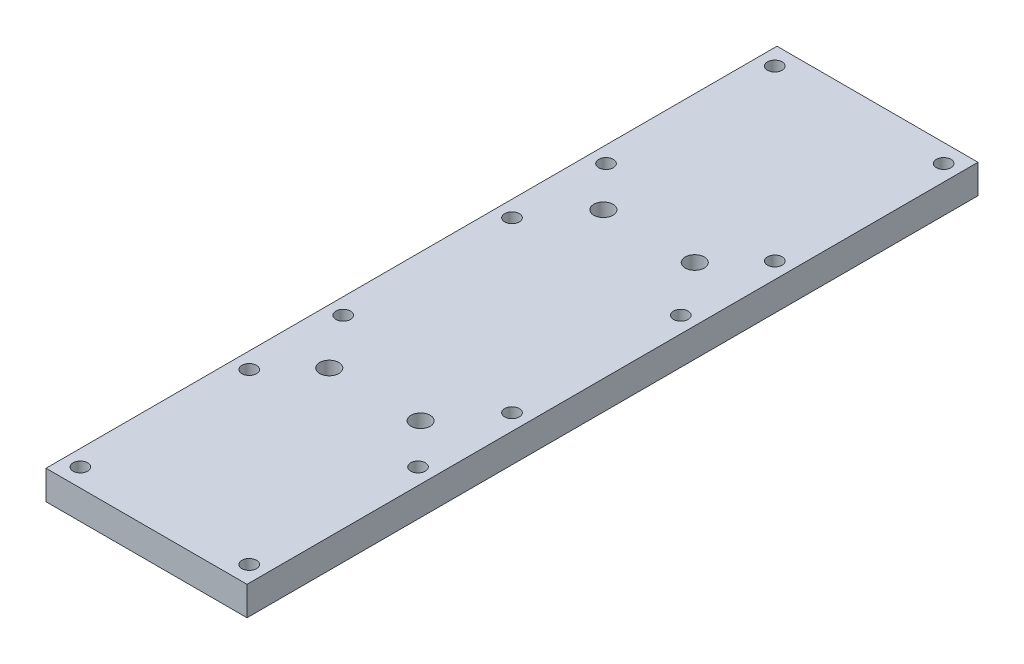
ISO-10303-21;
HEADER;
FILE_DESCRIPTION(('STEP AP214'),'2;1');
FILE_NAME('part.step','',(''),(''),'','','');
FILE_SCHEMA(('AUTOMOTIVE_DESIGN { 1 0 10303 214 1 1 1 1 }'));
ENDSEC;
DATA;
#1=APPLICATION_CONTEXT('core data for automotive mechanical design processes');
#2=APPLICATION_PROTOCOL_DEFINITION('international standard','automotive_design',2000,#1);
#3=PRODUCT_CONTEXT('',#1,'mechanical');
#4=PRODUCT('Part','Part','',(#3));
#5=PRODUCT_RELATED_PRODUCT_CATEGORY('part','',(#4));
#6=PRODUCT_DEFINITION_FORMATION('','',#4);
#7=PRODUCT_DEFINITION_CONTEXT('part definition',#1,'design');
#8=PRODUCT_DEFINITION('design','',#6,#7);
#9=PRODUCT_DEFINITION_SHAPE('','',#8);
#10=(LENGTH_UNIT() NAMED_UNIT(*) SI_UNIT(.MILLI.,.METRE.));
#11=(NAMED_UNIT(*) PLANE_ANGLE_UNIT() SI_UNIT($,.RADIAN.));
#12=(NAMED_UNIT(*) SI_UNIT($,.STERADIAN.) SOLID_ANGLE_UNIT());
#13=UNCERTAINTY_MEASURE_WITH_UNIT(LENGTH_MEASURE(1.E-05),#10,'distance_accuracy_value','');
#14=(GEOMETRIC_REPRESENTATION_CONTEXT(3) GLOBAL_UNCERTAINTY_ASSIGNED_CONTEXT((#13)) GLOBAL_UNIT_ASSIGNED_CONTEXT((#10,
#11,#12)) REPRESENTATION_CONTEXT('',''));
#15=CARTESIAN_POINT('',(0.,0.,0.));
#16=DIRECTION('',(0.,0.,1.));
#17=DIRECTION('',(1.,0.,0.));
#18=AXIS2_PLACEMENT_3D('',#15,#16,#17);
#19=CARTESIAN_POINT('',(22.,6.35,-80.));
#20=DIRECTION('',(-1.,0.,0.));
#21=DIRECTION('',(0.,0.,1.));
#22=AXIS2_PLACEMENT_3D('',#19,#20,#21);
#23=PLANE('',#22);
#24=DIRECTION('',(0.,0.,-1.));
#25=VECTOR('',#24,1.);
#26=CARTESIAN_POINT('',(22.,0.,-80.));
#27=LINE('',#26,#25);
#28=CARTESIAN_POINT('',(22.,0.,80.));
#29=VERTEX_POINT('',#28);
#30=CARTESIAN_POINT('',(22.,0.,-80.));
#31=VERTEX_POINT('',#30);
#32=EDGE_CURVE('E95',#29,#31,#27,.T.);
#33=ORIENTED_EDGE('',*,*,#32,.T.);
#34=DIRECTION('',(0.,-1.,0.));
#35=VECTOR('',#34,1.);
#36=CARTESIAN_POINT('',(22.,6.35,-80.));
#37=LINE('',#36,#35);
#38=CARTESIAN_POINT('',(22.,6.35,-80.));
#39=VERTEX_POINT('',#38);
#40=EDGE_CURVE('E11',#39,#31,#37,.T.);
#41=ORIENTED_EDGE('',*,*,#40,.F.);
#42=DIRECTION('',(0.,0.,-1.));
#43=VECTOR('',#42,1.);
#44=CARTESIAN_POINT('',(22.,6.35,-80.));
#45=LINE('',#44,#43);
#46=CARTESIAN_POINT('',(22.,6.35,80.));
#47=VERTEX_POINT('',#46);
#48=EDGE_CURVE('E83',#47,#39,#45,.T.);
#49=ORIENTED_EDGE('',*,*,#48,.F.);
#50=DIRECTION('',(0.,-1.,0.));
#51=VECTOR('',#50,1.);
#52=CARTESIAN_POINT('',(22.,6.35,80.));
#53=LINE('',#52,#51);
#54=EDGE_CURVE('E91',#47,#29,#53,.T.);
#55=ORIENTED_EDGE('',*,*,#54,.T.);
#56=EDGE_LOOP('',(#33,#41,#49,#55));
#57=FACE_BOUND('',#56,.T.);
#58=ADVANCED_FACE('F32',(#57),#23,.F.);
#59=CARTESIAN_POINT('',(-22.,6.35,-80.));
#60=DIRECTION('',(0.,0.,1.));
#61=DIRECTION('',(1.,0.,0.));
#62=AXIS2_PLACEMENT_3D('',#59,#60,#61);
#63=PLANE('',#62);
#64=DIRECTION('',(-1.,0.,0.));
#65=VECTOR('',#64,1.);
#66=CARTESIAN_POINT('',(-22.,0.,-80.));
#67=LINE('',#66,#65);
#68=CARTESIAN_POINT('',(-22.,0.,-80.));
#69=VERTEX_POINT('',#68);
#70=EDGE_CURVE('E87',#31,#69,#67,.T.);
#71=ORIENTED_EDGE('',*,*,#70,.T.);
#72=DIRECTION('',(0.,-1.,0.));
#73=VECTOR('',#72,1.);
#74=CARTESIAN_POINT('',(-22.,6.35,-80.));
#75=LINE('',#74,#73);
#76=CARTESIAN_POINT('',(-22.,6.35,-80.));
#77=VERTEX_POINT('',#76);
#78=EDGE_CURVE('E40',#77,#69,#75,.T.);
#79=ORIENTED_EDGE('',*,*,#78,.F.);
#80=DIRECTION('',(-1.,0.,0.));
#81=VECTOR('',#80,1.);
#82=CARTESIAN_POINT('',(-22.,6.35,-80.));
#83=LINE('',#82,#81);
#84=EDGE_CURVE('E78',#39,#77,#83,.T.);
#85=ORIENTED_EDGE('',*,*,#84,.F.);
#86=ORIENTED_EDGE('',*,*,#40,.T.);
#87=EDGE_LOOP('',(#71,#79,#85,#86));
#88=FACE_BOUND('',#87,.T.);
#89=ADVANCED_FACE('F86',(#88),#63,.F.);
#90=CARTESIAN_POINT('',(-22.,6.35,-80.));
#91=DIRECTION('',(1.,0.,0.));
#92=DIRECTION('',(0.,0.,-1.));
#93=AXIS2_PLACEMENT_3D('',#90,#91,#92);
#94=PLANE('',#93);
#95=DIRECTION('',(0.,0.,1.));
#96=VECTOR('',#95,1.);
#97=CARTESIAN_POINT('',(-22.,0.,-80.));
#98=LINE('',#97,#96);
#99=CARTESIAN_POINT('',(-22.,0.,80.));
#100=VERTEX_POINT('',#99);
#101=EDGE_CURVE('E65',#69,#100,#98,.T.);
#102=ORIENTED_EDGE('',*,*,#101,.T.);
#103=DIRECTION('',(0.,-1.,0.));
#104=VECTOR('',#103,1.);
#105=CARTESIAN_POINT('',(-22.,6.35,80.));
#106=LINE('',#105,#104);
#107=CARTESIAN_POINT('',(-22.,6.35,80.));
#108=VERTEX_POINT('',#107);
#109=EDGE_CURVE('E88',#108,#100,#106,.T.);
#110=ORIENTED_EDGE('',*,*,#109,.F.);
#111=DIRECTION('',(0.,0.,1.));
#112=VECTOR('',#111,1.);
#113=CARTESIAN_POINT('',(-22.,6.35,-80.));
#114=LINE('',#113,#112);
#115=EDGE_CURVE('E81',#77,#108,#114,.T.);
#116=ORIENTED_EDGE('',*,*,#115,.F.);
#117=ORIENTED_EDGE('',*,*,#78,.T.);
#118=EDGE_LOOP('',(#102,#110,#116,#117));
#119=FACE_BOUND('',#118,.T.);
#120=ADVANCED_FACE('F89',(#119),#94,.F.);
#121=CARTESIAN_POINT('',(-22.,6.35,80.));
#122=DIRECTION('',(0.,0.,-1.));
#123=DIRECTION('',(-1.,0.,0.));
#124=AXIS2_PLACEMENT_3D('',#121,#122,#123);
#125=PLANE('',#124);
#126=DIRECTION('',(1.,0.,0.));
#127=VECTOR('',#126,1.);
#128=CARTESIAN_POINT('',(-22.,0.,80.));
#129=LINE('',#128,#127);
#130=EDGE_CURVE('E71',#100,#29,#129,.T.);
#131=ORIENTED_EDGE('',*,*,#130,.T.);
#132=ORIENTED_EDGE('',*,*,#54,.F.);
#133=DIRECTION('',(1.,0.,0.));
#134=VECTOR('',#133,1.);
#135=CARTESIAN_POINT('',(-22.,6.35,80.));
#136=LINE('',#135,#134);
#137=EDGE_CURVE('E48',#108,#47,#136,.T.);
#138=ORIENTED_EDGE('',*,*,#137,.F.);
#139=ORIENTED_EDGE('',*,*,#109,.T.);
#140=EDGE_LOOP('',(#131,#132,#138,#139));
#141=FACE_BOUND('',#140,.T.);
#142=ADVANCED_FACE('F103',(#141),#125,.F.);
#143=CARTESIAN_POINT('',(0.,6.35,0.));
#144=DIRECTION('',(0.,1.,0.));
#145=DIRECTION('',(0.,0.,1.));
#146=AXIS2_PLACEMENT_3D('',#143,#144,#145);
#147=PLANE('',#146);
#148=CARTESIAN_POINT('',(10.,6.35,-30.));
#149=DIRECTION('',(0.,1.,0.));
#150=DIRECTION('',(0.,0.,1.));
#151=AXIS2_PLACEMENT_3D('',#148,#149,#150);
#152=CIRCLE('',#151,2.1);
#153=CARTESIAN_POINT('',(10.,6.35,-27.9));
#154=VERTEX_POINT('',#153);
#155=EDGE_CURVE('E199',#154,#154,#152,.T.);
#156=ORIENTED_EDGE('',*,*,#155,.F.);
#157=EDGE_LOOP('',(#156));
#158=FACE_BOUND('',#157,.T.);
#159=CARTESIAN_POINT('',(-10.,6.35,30.));
#160=DIRECTION('',(0.,1.,0.));
#161=DIRECTION('',(0.,0.,1.));
#162=AXIS2_PLACEMENT_3D('',#159,#160,#161);
#163=CIRCLE('',#162,2.1);
#164=CARTESIAN_POINT('',(-10.,6.35,32.1));
#165=VERTEX_POINT('',#164);
#166=EDGE_CURVE('E193',#165,#165,#163,.T.);
#167=ORIENTED_EDGE('',*,*,#166,.F.);
#168=EDGE_LOOP('',(#167));
#169=FACE_BOUND('',#168,.T.);
#170=CARTESIAN_POINT('',(10.,6.35,30.));
#171=DIRECTION('',(0.,1.,0.));
#172=DIRECTION('',(0.,0.,1.));
#173=AXIS2_PLACEMENT_3D('',#170,#171,#172);
#174=CIRCLE('',#173,2.1);
#175=CARTESIAN_POINT('',(10.,6.35,32.1));
#176=VERTEX_POINT('',#175);
#177=EDGE_CURVE('E187',#176,#176,#174,.T.);
#178=ORIENTED_EDGE('',*,*,#177,.F.);
#179=EDGE_LOOP('',(#178));
#180=FACE_BOUND('',#179,.T.);
#181=CARTESIAN_POINT('',(-10.,6.35,-30.));
#182=DIRECTION('',(0.,1.,0.));
#183=DIRECTION('',(0.,0.,1.));
#184=AXIS2_PLACEMENT_3D('',#181,#182,#183);
#185=CIRCLE('',#184,2.1);
#186=CARTESIAN_POINT('',(-10.,6.35,-27.9));
#187=VERTEX_POINT('',#186);
#188=EDGE_CURVE('E181',#187,#187,#185,.T.);
#189=ORIENTED_EDGE('',*,*,#188,.F.);
#190=EDGE_LOOP('',(#189));
#191=FACE_BOUND('',#190,.T.);
#192=CARTESIAN_POINT('',(-18.475,6.35,39.05));
#193=DIRECTION('',(0.,1.,0.));
#194=DIRECTION('',(0.,0.,1.));
#195=AXIS2_PLACEMENT_3D('',#192,#193,#194);
#196=CIRCLE('',#195,1.6);
#197=CARTESIAN_POINT('',(-18.475,6.35,40.65));
#198=VERTEX_POINT('',#197);
#199=EDGE_CURVE('E151',#198,#198,#196,.T.);
#200=ORIENTED_EDGE('',*,*,#199,.F.);
#201=EDGE_LOOP('',(#200));
#202=FACE_BOUND('',#201,.T.);
#203=CARTESIAN_POINT('',(18.475,6.35,-76.));
#204=DIRECTION('',(0.,1.,0.));
#205=DIRECTION('',(0.,0.,1.));
#206=AXIS2_PLACEMENT_3D('',#203,#204,#205);
#207=CIRCLE('',#206,1.6);
#208=CARTESIAN_POINT('',(18.475,6.35,-74.4));
#209=VERTEX_POINT('',#208);
#210=EDGE_CURVE('E158',#209,#209,#207,.T.);
#211=ORIENTED_EDGE('',*,*,#210,.F.);
#212=EDGE_LOOP('',(#211));
#213=FACE_BOUND('',#212,.T.);
#214=CARTESIAN_POINT('',(18.475,6.35,-39.05));
#215=DIRECTION('',(0.,1.,0.));
#216=DIRECTION('',(0.,0.,1.));
#217=AXIS2_PLACEMENT_3D('',#214,#215,#216);
#218=CIRCLE('',#217,1.6);
#219=CARTESIAN_POINT('',(18.475,6.35,-37.45));
#220=VERTEX_POINT('',#219);
#221=EDGE_CURVE('E145',#220,#220,#218,.T.);
#222=ORIENTED_EDGE('',*,*,#221,.F.);
#223=EDGE_LOOP('',(#222));
#224=FACE_BOUND('',#223,.T.);
#225=CARTESIAN_POINT('',(-18.475,6.35,76.));
#226=DIRECTION('',(0.,1.,0.));
#227=DIRECTION('',(0.,0.,1.));
#228=AXIS2_PLACEMENT_3D('',#225,#226,#227);
#229=CIRCLE('',#228,1.60000000000001);
#230=CARTESIAN_POINT('',(-18.475,6.35,77.6));
#231=VERTEX_POINT('',#230);
#232=EDGE_CURVE('E176',#231,#231,#229,.T.);
#233=ORIENTED_EDGE('',*,*,#232,.F.);
#234=EDGE_LOOP('',(#233));
#235=FACE_BOUND('',#234,.T.);
#236=CARTESIAN_POINT('',(18.475,6.35,76.));
#237=DIRECTION('',(0.,1.,0.));
#238=DIRECTION('',(0.,0.,1.));
#239=AXIS2_PLACEMENT_3D('',#236,#237,#238);
#240=CIRCLE('',#239,1.60000000000001);
#241=CARTESIAN_POINT('',(18.475,6.35,77.6));
#242=VERTEX_POINT('',#241);
#243=EDGE_CURVE('E170',#242,#242,#240,.T.);
#244=ORIENTED_EDGE('',*,*,#243,.F.);
#245=EDGE_LOOP('',(#244));
#246=FACE_BOUND('',#245,.T.);
#247=CARTESIAN_POINT('',(18.475,6.35,39.05));
#248=DIRECTION('',(0.,1.,0.));
#249=DIRECTION('',(0.,0.,1.));
#250=AXIS2_PLACEMENT_3D('',#247,#248,#249);
#251=CIRCLE('',#250,1.60000000000001);
#252=CARTESIAN_POINT('',(18.475,6.35,40.65));
#253=VERTEX_POINT('',#252);
#254=EDGE_CURVE('E163',#253,#253,#251,.T.);
#255=ORIENTED_EDGE('',*,*,#254,.F.);
#256=EDGE_LOOP('',(#255));
#257=FACE_BOUND('',#256,.T.);
#258=CARTESIAN_POINT('',(-18.475,6.35,-39.05));
#259=DIRECTION('',(0.,1.,0.));
#260=DIRECTION('',(0.,0.,1.));
#261=AXIS2_PLACEMENT_3D('',#258,#259,#260);
#262=CIRCLE('',#261,1.6);
#263=CARTESIAN_POINT('',(-18.475,6.35,-37.45));
#264=VERTEX_POINT('',#263);
#265=EDGE_CURVE('E115',#264,#264,#262,.T.);
#266=ORIENTED_EDGE('',*,*,#265,.F.);
#267=EDGE_LOOP('',(#266));
#268=FACE_BOUND('',#267,.T.);
#269=CARTESIAN_POINT('',(-18.475,6.35,-76.));
#270=DIRECTION('',(0.,1.,0.));
#271=DIRECTION('',(0.,0.,1.));
#272=AXIS2_PLACEMENT_3D('',#269,#270,#271);
#273=CIRCLE('',#272,1.6);
#274=CARTESIAN_POINT('',(-18.475,6.35,-74.4));
#275=VERTEX_POINT('',#274);
#276=EDGE_CURVE('E122',#275,#275,#273,.T.);
#277=ORIENTED_EDGE('',*,*,#276,.F.);
#278=EDGE_LOOP('',(#277));
#279=FACE_BOUND('',#278,.T.);
#280=CARTESIAN_POINT('',(18.475,6.35,-18.475));
#281=DIRECTION('',(0.,1.,0.));
#282=DIRECTION('',(0.,0.,1.));
#283=AXIS2_PLACEMENT_3D('',#280,#281,#282);
#284=CIRCLE('',#283,1.6);
#285=CARTESIAN_POINT('',(18.475,6.35,-16.875));
#286=VERTEX_POINT('',#285);
#287=EDGE_CURVE('E128',#286,#286,#284,.T.);
#288=ORIENTED_EDGE('',*,*,#287,.F.);
#289=EDGE_LOOP('',(#288));
#290=FACE_BOUND('',#289,.T.);
#291=CARTESIAN_POINT('',(18.475,6.35,18.475));
#292=DIRECTION('',(0.,1.,0.));
#293=DIRECTION('',(0.,0.,1.));
#294=AXIS2_PLACEMENT_3D('',#291,#292,#293);
#295=CIRCLE('',#294,1.6);
#296=CARTESIAN_POINT('',(18.475,6.35,20.075));
#297=VERTEX_POINT('',#296);
#298=EDGE_CURVE('E134',#297,#297,#295,.T.);
#299=ORIENTED_EDGE('',*,*,#298,.F.);
#300=EDGE_LOOP('',(#299));
#301=FACE_BOUND('',#300,.T.);
#302=CARTESIAN_POINT('',(-18.475,6.35,18.475));
#303=DIRECTION('',(0.,1.,0.));
#304=DIRECTION('',(0.,0.,1.));
#305=AXIS2_PLACEMENT_3D('',#302,#303,#304);
#306=CIRCLE('',#305,1.6);
#307=CARTESIAN_POINT('',(-18.475,6.35,20.075));
#308=VERTEX_POINT('',#307);
#309=EDGE_CURVE('E140',#308,#308,#306,.T.);
#310=ORIENTED_EDGE('',*,*,#309,.F.);
#311=EDGE_LOOP('',(#310));
#312=FACE_BOUND('',#311,.T.);
#313=CARTESIAN_POINT('',(-18.475,6.35,-18.475));
#314=DIRECTION('',(0.,1.,0.));
#315=DIRECTION('',(0.,0.,1.));
#316=AXIS2_PLACEMENT_3D('',#313,#314,#315);
#317=CIRCLE('',#316,1.6);
#318=CARTESIAN_POINT('',(-18.475,6.35,-16.875));
#319=VERTEX_POINT('',#318);
#320=EDGE_CURVE('E109',#319,#319,#317,.T.);
#321=ORIENTED_EDGE('',*,*,#320,.F.);
#322=EDGE_LOOP('',(#321));
#323=FACE_BOUND('',#322,.T.);
#324=ORIENTED_EDGE('',*,*,#48,.T.);
#325=ORIENTED_EDGE('',*,*,#84,.T.);
#326=ORIENTED_EDGE('',*,*,#115,.T.);
#327=ORIENTED_EDGE('',*,*,#137,.T.);
#328=EDGE_LOOP('',(#324,#325,#326,#327));
#329=FACE_BOUND('',#328,.T.);
#330=ADVANCED_FACE('F79',(#158,#169,#180,#191,#202,#213,#224,#235,#246,#257,#268,#279,#290,#301,
#312,#323,#329),#147,.T.);
#331=CARTESIAN_POINT('',(0.,0.,0.));
#332=DIRECTION('',(0.,1.,0.));
#333=DIRECTION('',(0.,0.,1.));
#334=AXIS2_PLACEMENT_3D('',#331,#332,#333);
#335=PLANE('',#334);
#336=CARTESIAN_POINT('',(10.,0.,-30.));
#337=DIRECTION('',(0.,1.,0.));
#338=DIRECTION('',(0.,0.,1.));
#339=AXIS2_PLACEMENT_3D('',#336,#337,#338);
#340=CIRCLE('',#339,2.1);
#341=CARTESIAN_POINT('',(10.,0.,-27.9));
#342=VERTEX_POINT('',#341);
#343=EDGE_CURVE('E184',#342,#342,#340,.T.);
#344=ORIENTED_EDGE('',*,*,#343,.T.);
#345=EDGE_LOOP('',(#344));
#346=FACE_BOUND('',#345,.T.);
#347=CARTESIAN_POINT('',(-10.,0.,30.));
#348=DIRECTION('',(0.,1.,0.));
#349=DIRECTION('',(0.,0.,1.));
#350=AXIS2_PLACEMENT_3D('',#347,#348,#349);
#351=CIRCLE('',#350,2.1);
#352=CARTESIAN_POINT('',(-10.,0.,32.1));
#353=VERTEX_POINT('',#352);
#354=EDGE_CURVE('E196',#353,#353,#351,.T.);
#355=ORIENTED_EDGE('',*,*,#354,.T.);
#356=EDGE_LOOP('',(#355));
#357=FACE_BOUND('',#356,.T.);
#358=CARTESIAN_POINT('',(10.,0.,30.));
#359=DIRECTION('',(0.,1.,0.));
#360=DIRECTION('',(0.,0.,1.));
#361=AXIS2_PLACEMENT_3D('',#358,#359,#360);
#362=CIRCLE('',#361,2.1);
#363=CARTESIAN_POINT('',(10.,0.,32.1));
#364=VERTEX_POINT('',#363);
#365=EDGE_CURVE('E190',#364,#364,#362,.T.);
#366=ORIENTED_EDGE('',*,*,#365,.T.);
#367=EDGE_LOOP('',(#366));
#368=FACE_BOUND('',#367,.T.);
#369=CARTESIAN_POINT('',(-10.,0.,-30.));
#370=DIRECTION('',(0.,1.,0.));
#371=DIRECTION('',(0.,0.,1.));
#372=AXIS2_PLACEMENT_3D('',#369,#370,#371);
#373=CIRCLE('',#372,2.1);
#374=CARTESIAN_POINT('',(-10.,0.,-27.9));
#375=VERTEX_POINT('',#374);
#376=EDGE_CURVE('E167',#375,#375,#373,.T.);
#377=ORIENTED_EDGE('',*,*,#376,.T.);
#378=EDGE_LOOP('',(#377));
#379=FACE_BOUND('',#378,.T.);
#380=CARTESIAN_POINT('',(-18.475,0.,39.05));
#381=DIRECTION('',(0.,1.,0.));
#382=DIRECTION('',(0.,0.,1.));
#383=AXIS2_PLACEMENT_3D('',#380,#381,#382);
#384=CIRCLE('',#383,1.6);
#385=CARTESIAN_POINT('',(-18.475,0.,40.65));
#386=VERTEX_POINT('',#385);
#387=EDGE_CURVE('E154',#386,#386,#384,.T.);
#388=ORIENTED_EDGE('',*,*,#387,.T.);
#389=EDGE_LOOP('',(#388));
#390=FACE_BOUND('',#389,.T.);
#391=CARTESIAN_POINT('',(18.475,0.,-76.));
#392=DIRECTION('',(0.,1.,0.));
#393=DIRECTION('',(0.,0.,1.));
#394=AXIS2_PLACEMENT_3D('',#391,#392,#393);
#395=CIRCLE('',#394,1.6);
#396=CARTESIAN_POINT('',(18.475,0.,-74.4));
#397=VERTEX_POINT('',#396);
#398=EDGE_CURVE('E148',#397,#397,#395,.T.);
#399=ORIENTED_EDGE('',*,*,#398,.T.);
#400=EDGE_LOOP('',(#399));
#401=FACE_BOUND('',#400,.T.);
#402=CARTESIAN_POINT('',(18.475,0.,-39.05));
#403=DIRECTION('',(0.,1.,0.));
#404=DIRECTION('',(0.,0.,1.));
#405=AXIS2_PLACEMENT_3D('',#402,#403,#404);
#406=CIRCLE('',#405,1.6);
#407=CARTESIAN_POINT('',(18.475,0.,-37.45));
#408=VERTEX_POINT('',#407);
#409=EDGE_CURVE('E119',#408,#408,#406,.T.);
#410=ORIENTED_EDGE('',*,*,#409,.T.);
#411=EDGE_LOOP('',(#410));
#412=FACE_BOUND('',#411,.T.);
#413=CARTESIAN_POINT('',(-18.475,0.,76.));
#414=DIRECTION('',(0.,1.,0.));
#415=DIRECTION('',(0.,0.,1.));
#416=AXIS2_PLACEMENT_3D('',#413,#414,#415);
#417=CIRCLE('',#416,1.60000000000001);
#418=CARTESIAN_POINT('',(-18.475,0.,77.6));
#419=VERTEX_POINT('',#418);
#420=EDGE_CURVE('E155',#419,#419,#417,.T.);
#421=ORIENTED_EDGE('',*,*,#420,.T.);
#422=EDGE_LOOP('',(#421));
#423=FACE_BOUND('',#422,.T.);
#424=CARTESIAN_POINT('',(18.475,0.,76.));
#425=DIRECTION('',(0.,1.,0.));
#426=DIRECTION('',(0.,0.,1.));
#427=AXIS2_PLACEMENT_3D('',#424,#425,#426);
#428=CIRCLE('',#427,1.60000000000001);
#429=CARTESIAN_POINT('',(18.475,0.,77.6));
#430=VERTEX_POINT('',#429);
#431=EDGE_CURVE('E173',#430,#430,#428,.T.);
#432=ORIENTED_EDGE('',*,*,#431,.T.);
#433=EDGE_LOOP('',(#432));
#434=FACE_BOUND('',#433,.T.);
#435=CARTESIAN_POINT('',(18.475,0.,39.05));
#436=DIRECTION('',(0.,1.,0.));
#437=DIRECTION('',(0.,0.,1.));
#438=AXIS2_PLACEMENT_3D('',#435,#436,#437);
#439=CIRCLE('',#438,1.60000000000001);
#440=CARTESIAN_POINT('',(18.475,0.,40.65));
#441=VERTEX_POINT('',#440);
#442=EDGE_CURVE('E166',#441,#441,#439,.T.);
#443=ORIENTED_EDGE('',*,*,#442,.T.);
#444=EDGE_LOOP('',(#443));
#445=FACE_BOUND('',#444,.T.);
#446=CARTESIAN_POINT('',(-18.475,0.,-39.05));
#447=DIRECTION('',(0.,1.,0.));
#448=DIRECTION('',(0.,0.,1.));
#449=AXIS2_PLACEMENT_3D('',#446,#447,#448);
#450=CIRCLE('',#449,1.6);
#451=CARTESIAN_POINT('',(-18.475,0.,-37.45));
#452=VERTEX_POINT('',#451);
#453=EDGE_CURVE('E118',#452,#452,#450,.T.);
#454=ORIENTED_EDGE('',*,*,#453,.T.);
#455=EDGE_LOOP('',(#454));
#456=FACE_BOUND('',#455,.T.);
#457=CARTESIAN_POINT('',(-18.475,0.,-76.));
#458=DIRECTION('',(0.,1.,0.));
#459=DIRECTION('',(0.,0.,1.));
#460=AXIS2_PLACEMENT_3D('',#457,#458,#459);
#461=CIRCLE('',#460,1.6);
#462=CARTESIAN_POINT('',(-18.475,0.,-74.4));
#463=VERTEX_POINT('',#462);
#464=EDGE_CURVE('E125',#463,#463,#461,.T.);
#465=ORIENTED_EDGE('',*,*,#464,.T.);
#466=EDGE_LOOP('',(#465));
#467=FACE_BOUND('',#466,.T.);
#468=CARTESIAN_POINT('',(18.475,0.,-18.475));
#469=DIRECTION('',(0.,1.,0.));
#470=DIRECTION('',(0.,0.,1.));
#471=AXIS2_PLACEMENT_3D('',#468,#469,#470);
#472=CIRCLE('',#471,1.6);
#473=CARTESIAN_POINT('',(18.475,0.,-16.875));
#474=VERTEX_POINT('',#473);
#475=EDGE_CURVE('E131',#474,#474,#472,.T.);
#476=ORIENTED_EDGE('',*,*,#475,.T.);
#477=EDGE_LOOP('',(#476));
#478=FACE_BOUND('',#477,.T.);
#479=CARTESIAN_POINT('',(18.475,0.,18.475));
#480=DIRECTION('',(0.,1.,0.));
#481=DIRECTION('',(0.,0.,1.));
#482=AXIS2_PLACEMENT_3D('',#479,#480,#481);
#483=CIRCLE('',#482,1.6);
#484=CARTESIAN_POINT('',(18.475,0.,20.075));
#485=VERTEX_POINT('',#484);
#486=EDGE_CURVE('E137',#485,#485,#483,.T.);
#487=ORIENTED_EDGE('',*,*,#486,.T.);
#488=EDGE_LOOP('',(#487));
#489=FACE_BOUND('',#488,.T.);
#490=CARTESIAN_POINT('',(-18.475,0.,18.475));
#491=DIRECTION('',(0.,1.,0.));
#492=DIRECTION('',(0.,0.,1.));
#493=AXIS2_PLACEMENT_3D('',#490,#491,#492);
#494=CIRCLE('',#493,1.6);
#495=CARTESIAN_POINT('',(-18.475,0.,20.075));
#496=VERTEX_POINT('',#495);
#497=EDGE_CURVE('E112',#496,#496,#494,.T.);
#498=ORIENTED_EDGE('',*,*,#497,.T.);
#499=EDGE_LOOP('',(#498));
#500=FACE_BOUND('',#499,.T.);
#501=CARTESIAN_POINT('',(-18.475,0.,-18.475));
#502=DIRECTION('',(0.,1.,0.));
#503=DIRECTION('',(0.,0.,1.));
#504=AXIS2_PLACEMENT_3D('',#501,#502,#503);
#505=CIRCLE('',#504,1.6);
#506=CARTESIAN_POINT('',(-18.475,0.,-16.875));
#507=VERTEX_POINT('',#506);
#508=EDGE_CURVE('E98',#507,#507,#505,.T.);
#509=ORIENTED_EDGE('',*,*,#508,.T.);
#510=EDGE_LOOP('',(#509));
#511=FACE_BOUND('',#510,.T.);
#512=ORIENTED_EDGE('',*,*,#32,.F.);
#513=ORIENTED_EDGE('',*,*,#130,.F.);
#514=ORIENTED_EDGE('',*,*,#101,.F.);
#515=ORIENTED_EDGE('',*,*,#70,.F.);
#516=EDGE_LOOP('',(#512,#513,#514,#515));
#517=FACE_BOUND('',#516,.T.);
#518=ADVANCED_FACE('F106',(#346,#357,#368,#379,#390,#401,#412,#423,#434,#445,#456,#467,#478,
#489,#500,#511,#517),#335,.F.);
#519=CARTESIAN_POINT('',(-18.475,0.,-18.475));
#520=DIRECTION('',(0.,1.,0.));
#521=DIRECTION('',(0.,0.,1.));
#522=AXIS2_PLACEMENT_3D('',#519,#520,#521);
#523=CYLINDRICAL_SURFACE('',#522,1.6);
#524=ORIENTED_EDGE('',*,*,#508,.F.);
#525=EDGE_LOOP('',(#524));
#526=FACE_BOUND('',#525,.T.);
#527=ORIENTED_EDGE('',*,*,#320,.T.);
#528=EDGE_LOOP('',(#527));
#529=FACE_BOUND('',#528,.T.);
#530=ADVANCED_FACE('F247',(#526,#529),#523,.F.);
#531=CARTESIAN_POINT('',(-18.475,0.,18.475));
#532=DIRECTION('',(0.,1.,0.));
#533=DIRECTION('',(0.,0.,1.));
#534=AXIS2_PLACEMENT_3D('',#531,#532,#533);
#535=CYLINDRICAL_SURFACE('',#534,1.6);
#536=ORIENTED_EDGE('',*,*,#497,.F.);
#537=EDGE_LOOP('',(#536));
#538=FACE_BOUND('',#537,.T.);
#539=ORIENTED_EDGE('',*,*,#309,.T.);
#540=EDGE_LOOP('',(#539));
#541=FACE_BOUND('',#540,.T.);
#542=ADVANCED_FACE('F249',(#538,#541),#535,.F.);
#543=CARTESIAN_POINT('',(18.475,0.,18.475));
#544=DIRECTION('',(0.,1.,0.));
#545=DIRECTION('',(0.,0.,1.));
#546=AXIS2_PLACEMENT_3D('',#543,#544,#545);
#547=CYLINDRICAL_SURFACE('',#546,1.6);
#548=ORIENTED_EDGE('',*,*,#486,.F.);
#549=EDGE_LOOP('',(#548));
#550=FACE_BOUND('',#549,.T.);
#551=ORIENTED_EDGE('',*,*,#298,.T.);
#552=EDGE_LOOP('',(#551));
#553=FACE_BOUND('',#552,.T.);
#554=ADVANCED_FACE('F256',(#550,#553),#547,.F.);
#555=CARTESIAN_POINT('',(18.475,0.,-18.475));
#556=DIRECTION('',(0.,1.,0.));
#557=DIRECTION('',(0.,0.,1.));
#558=AXIS2_PLACEMENT_3D('',#555,#556,#557);
#559=CYLINDRICAL_SURFACE('',#558,1.6);
#560=ORIENTED_EDGE('',*,*,#475,.F.);
#561=EDGE_LOOP('',(#560));
#562=FACE_BOUND('',#561,.T.);
#563=ORIENTED_EDGE('',*,*,#287,.T.);
#564=EDGE_LOOP('',(#563));
#565=FACE_BOUND('',#564,.T.);
#566=ADVANCED_FACE('F358',(#562,#565),#559,.F.);
#567=CARTESIAN_POINT('',(-18.475,0.,-76.));
#568=DIRECTION('',(0.,1.,0.));
#569=DIRECTION('',(0.,0.,1.));
#570=AXIS2_PLACEMENT_3D('',#567,#568,#569);
#571=CYLINDRICAL_SURFACE('',#570,1.6);
#572=ORIENTED_EDGE('',*,*,#464,.F.);
#573=EDGE_LOOP('',(#572));
#574=FACE_BOUND('',#573,.T.);
#575=ORIENTED_EDGE('',*,*,#276,.T.);
#576=EDGE_LOOP('',(#575));
#577=FACE_BOUND('',#576,.T.);
#578=ADVANCED_FACE('F362',(#574,#577),#571,.F.);
#579=CARTESIAN_POINT('',(-18.475,0.,-39.05));
#580=DIRECTION('',(0.,1.,0.));
#581=DIRECTION('',(0.,0.,1.));
#582=AXIS2_PLACEMENT_3D('',#579,#580,#581);
#583=CYLINDRICAL_SURFACE('',#582,1.6);
#584=ORIENTED_EDGE('',*,*,#453,.F.);
#585=EDGE_LOOP('',(#584));
#586=FACE_BOUND('',#585,.T.);
#587=ORIENTED_EDGE('',*,*,#265,.T.);
#588=EDGE_LOOP('',(#587));
#589=FACE_BOUND('',#588,.T.);
#590=ADVANCED_FACE('F345',(#586,#589),#583,.F.);
#591=CARTESIAN_POINT('',(18.475,0.,39.05));
#592=DIRECTION('',(0.,1.,0.));
#593=DIRECTION('',(0.,0.,1.));
#594=AXIS2_PLACEMENT_3D('',#591,#592,#593);
#595=CYLINDRICAL_SURFACE('',#594,1.60000000000001);
#596=ORIENTED_EDGE('',*,*,#442,.F.);
#597=EDGE_LOOP('',(#596));
#598=FACE_BOUND('',#597,.T.);
#599=ORIENTED_EDGE('',*,*,#254,.T.);
#600=EDGE_LOOP('',(#599));
#601=FACE_BOUND('',#600,.T.);
#602=ADVANCED_FACE('F341',(#598,#601),#595,.F.);
#603=CARTESIAN_POINT('',(18.475,0.,76.));
#604=DIRECTION('',(0.,1.,0.));
#605=DIRECTION('',(0.,0.,1.));
#606=AXIS2_PLACEMENT_3D('',#603,#604,#605);
#607=CYLINDRICAL_SURFACE('',#606,1.60000000000001);
#608=ORIENTED_EDGE('',*,*,#431,.F.);
#609=EDGE_LOOP('',(#608));
#610=FACE_BOUND('',#609,.T.);
#611=ORIENTED_EDGE('',*,*,#243,.T.);
#612=EDGE_LOOP('',(#611));
#613=FACE_BOUND('',#612,.T.);
#614=ADVANCED_FACE('F337',(#610,#613),#607,.F.);
#615=CARTESIAN_POINT('',(-18.475,0.,76.));
#616=DIRECTION('',(0.,1.,0.));
#617=DIRECTION('',(0.,0.,1.));
#618=AXIS2_PLACEMENT_3D('',#615,#616,#617);
#619=CYLINDRICAL_SURFACE('',#618,1.60000000000001);
#620=ORIENTED_EDGE('',*,*,#420,.F.);
#621=EDGE_LOOP('',(#620));
#622=FACE_BOUND('',#621,.T.);
#623=ORIENTED_EDGE('',*,*,#232,.T.);
#624=EDGE_LOOP('',(#623));
#625=FACE_BOUND('',#624,.T.);
#626=ADVANCED_FACE('F333',(#622,#625),#619,.F.);
#627=CARTESIAN_POINT('',(18.475,0.,-39.05));
#628=DIRECTION('',(0.,1.,0.));
#629=DIRECTION('',(0.,0.,1.));
#630=AXIS2_PLACEMENT_3D('',#627,#628,#629);
#631=CYLINDRICAL_SURFACE('',#630,1.6);
#632=ORIENTED_EDGE('',*,*,#409,.F.);
#633=EDGE_LOOP('',(#632));
#634=FACE_BOUND('',#633,.T.);
#635=ORIENTED_EDGE('',*,*,#221,.T.);
#636=EDGE_LOOP('',(#635));
#637=FACE_BOUND('',#636,.T.);
#638=ADVANCED_FACE('F336',(#634,#637),#631,.F.);
#639=CARTESIAN_POINT('',(18.475,0.,-76.));
#640=DIRECTION('',(0.,1.,0.));
#641=DIRECTION('',(0.,0.,1.));
#642=AXIS2_PLACEMENT_3D('',#639,#640,#641);
#643=CYLINDRICAL_SURFACE('',#642,1.6);
#644=ORIENTED_EDGE('',*,*,#398,.F.);
#645=EDGE_LOOP('',(#644));
#646=FACE_BOUND('',#645,.T.);
#647=ORIENTED_EDGE('',*,*,#210,.T.);
#648=EDGE_LOOP('',(#647));
#649=FACE_BOUND('',#648,.T.);
#650=ADVANCED_FACE('F347',(#646,#649),#643,.F.);
#651=CARTESIAN_POINT('',(-18.475,0.,39.05));
#652=DIRECTION('',(0.,1.,0.));
#653=DIRECTION('',(0.,0.,1.));
#654=AXIS2_PLACEMENT_3D('',#651,#652,#653);
#655=CYLINDRICAL_SURFACE('',#654,1.6);
#656=ORIENTED_EDGE('',*,*,#387,.F.);
#657=EDGE_LOOP('',(#656));
#658=FACE_BOUND('',#657,.T.);
#659=ORIENTED_EDGE('',*,*,#199,.T.);
#660=EDGE_LOOP('',(#659));
#661=FACE_BOUND('',#660,.T.);
#662=ADVANCED_FACE('F299',(#658,#661),#655,.F.);
#663=CARTESIAN_POINT('',(-10.,0.,-30.));
#664=DIRECTION('',(0.,1.,0.));
#665=DIRECTION('',(0.,0.,1.));
#666=AXIS2_PLACEMENT_3D('',#663,#664,#665);
#667=CYLINDRICAL_SURFACE('',#666,2.1);
#668=ORIENTED_EDGE('',*,*,#376,.F.);
#669=EDGE_LOOP('',(#668));
#670=FACE_BOUND('',#669,.T.);
#671=ORIENTED_EDGE('',*,*,#188,.T.);
#672=EDGE_LOOP('',(#671));
#673=FACE_BOUND('',#672,.T.);
#674=ADVANCED_FACE('F293',(#670,#673),#667,.F.);
#675=CARTESIAN_POINT('',(10.,0.,30.));
#676=DIRECTION('',(0.,1.,0.));
#677=DIRECTION('',(0.,0.,1.));
#678=AXIS2_PLACEMENT_3D('',#675,#676,#677);
#679=CYLINDRICAL_SURFACE('',#678,2.1);
#680=ORIENTED_EDGE('',*,*,#365,.F.);
#681=EDGE_LOOP('',(#680));
#682=FACE_BOUND('',#681,.T.);
#683=ORIENTED_EDGE('',*,*,#177,.T.);
#684=EDGE_LOOP('',(#683));
#685=FACE_BOUND('',#684,.T.);
#686=ADVANCED_FACE('F298',(#682,#685),#679,.F.);
#687=CARTESIAN_POINT('',(-10.,0.,30.));
#688=DIRECTION('',(0.,1.,0.));
#689=DIRECTION('',(0.,0.,1.));
#690=AXIS2_PLACEMENT_3D('',#687,#688,#689);
#691=CYLINDRICAL_SURFACE('',#690,2.1);
#692=ORIENTED_EDGE('',*,*,#354,.F.);
#693=EDGE_LOOP('',(#692));
#694=FACE_BOUND('',#693,.T.);
#695=ORIENTED_EDGE('',*,*,#166,.T.);
#696=EDGE_LOOP('',(#695));
#697=FACE_BOUND('',#696,.T.);
#698=ADVANCED_FACE('F210',(#694,#697),#691,.F.);
#699=CARTESIAN_POINT('',(10.,0.,-30.));
#700=DIRECTION('',(0.,1.,0.));
#701=DIRECTION('',(0.,0.,1.));
#702=AXIS2_PLACEMENT_3D('',#699,#700,#701);
#703=CYLINDRICAL_SURFACE('',#702,2.1);
#704=ORIENTED_EDGE('',*,*,#343,.F.);
#705=EDGE_LOOP('',(#704));
#706=FACE_BOUND('',#705,.T.);
#707=ORIENTED_EDGE('',*,*,#155,.T.);
#708=EDGE_LOOP('',(#707));
#709=FACE_BOUND('',#708,.T.);
#710=ADVANCED_FACE('F207',(#706,#709),#703,.F.);
#711=CLOSED_SHELL('',(#58,#89,#120,#142,#330,#518,#530,#542,#554,#566,#578,#590,#602,#614,#626,
#638,#650,#662,#674,#686,#698,#710));
#712=MANIFOLD_SOLID_BREP('B2',#711);
#713=ADVANCED_BREP_SHAPE_REPRESENTATION('',(#18,#712),#14);
#714=SHAPE_DEFINITION_REPRESENTATION(#9,#713);
ENDSEC;
END-ISO-10303-21;
